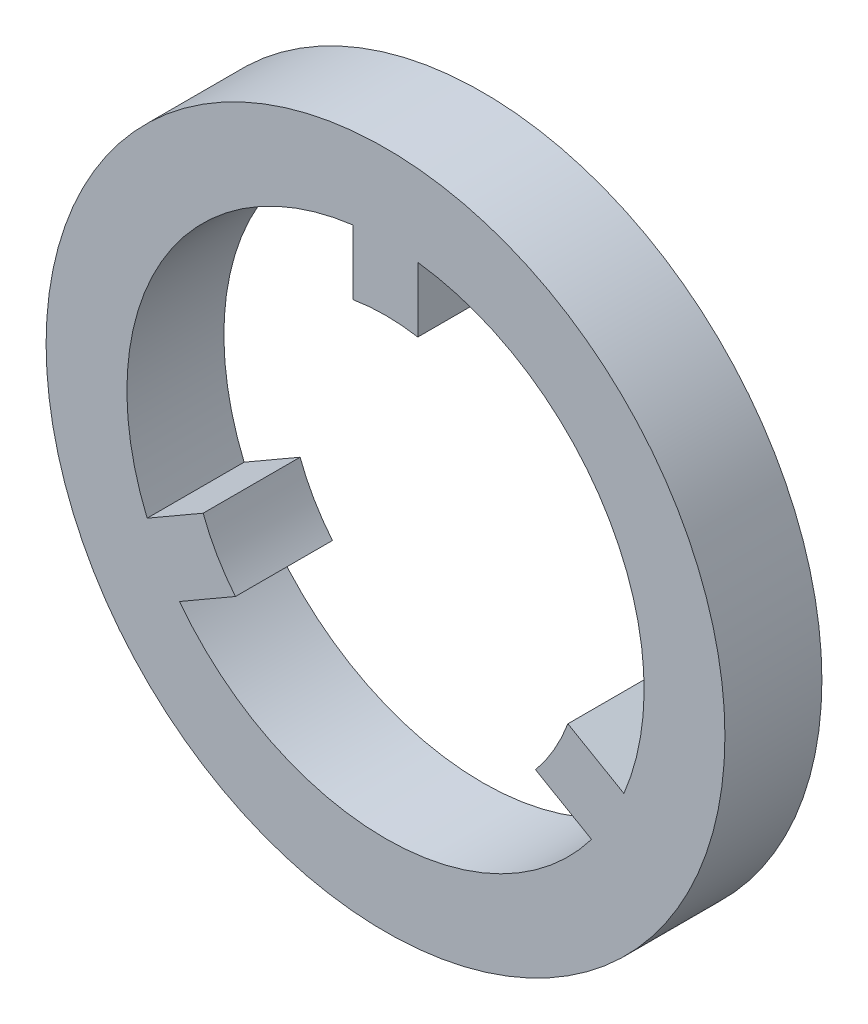
ISO-10303-21;
HEADER;
FILE_DESCRIPTION(('STEP AP214'),'2;1');
FILE_NAME('part.step','',(''),(''),'','','');
FILE_SCHEMA(('AUTOMOTIVE_DESIGN { 1 0 10303 214 1 1 1 1 }'));
ENDSEC;
DATA;
#1=APPLICATION_CONTEXT('core data for automotive mechanical design processes');
#2=APPLICATION_PROTOCOL_DEFINITION('international standard','automotive_design',2000,#1);
#3=PRODUCT_CONTEXT('',#1,'mechanical');
#4=PRODUCT('Part','Part','',(#3));
#5=PRODUCT_RELATED_PRODUCT_CATEGORY('part','',(#4));
#6=PRODUCT_DEFINITION_FORMATION('','',#4);
#7=PRODUCT_DEFINITION_CONTEXT('part definition',#1,'design');
#8=PRODUCT_DEFINITION('design','',#6,#7);
#9=PRODUCT_DEFINITION_SHAPE('','',#8);
#10=(LENGTH_UNIT() NAMED_UNIT(*) SI_UNIT(.MILLI.,.METRE.));
#11=(NAMED_UNIT(*) PLANE_ANGLE_UNIT() SI_UNIT($,.RADIAN.));
#12=(NAMED_UNIT(*) SI_UNIT($,.STERADIAN.) SOLID_ANGLE_UNIT());
#13=UNCERTAINTY_MEASURE_WITH_UNIT(LENGTH_MEASURE(1.E-05),#10,'distance_accuracy_value','');
#14=(GEOMETRIC_REPRESENTATION_CONTEXT(3) GLOBAL_UNCERTAINTY_ASSIGNED_CONTEXT((#13)) GLOBAL_UNIT_ASSIGNED_CONTEXT((#10,
#11,#12)) REPRESENTATION_CONTEXT('',''));
#15=CARTESIAN_POINT('',(0.,0.,0.));
#16=DIRECTION('',(0.,0.,1.));
#17=DIRECTION('',(1.,0.,0.));
#18=AXIS2_PLACEMENT_3D('',#15,#16,#17);
#19=CARTESIAN_POINT('',(0.,0.,3.));
#20=DIRECTION('',(0.,0.,-1.));
#21=DIRECTION('',(-1.,0.,0.));
#22=AXIS2_PLACEMENT_3D('',#19,#20,#21);
#23=CYLINDRICAL_SURFACE('',#22,8.00000000000001);
#24=CARTESIAN_POINT('',(0.,0.,0.));
#25=DIRECTION('',(0.,0.,1.));
#26=DIRECTION('',(1.,0.,0.));
#27=AXIS2_PLACEMENT_3D('',#24,#25,#26);
#28=CIRCLE('',#27,8.00000000000001);
#29=CARTESIAN_POINT('',(7.37386354243377,-3.10260156281245,0.));
#30=VERTEX_POINT('',#29);
#31=CARTESIAN_POINT('',(1.,7.93725393319378,0.));
#32=VERTEX_POINT('',#31);
#33=EDGE_CURVE('E160',#30,#32,#28,.T.);
#34=ORIENTED_EDGE('',*,*,#33,.F.);
#35=DIRECTION('',(0.,0.,-1.));
#36=VECTOR('',#35,1.);
#37=CARTESIAN_POINT('',(7.37386354243377,-3.10260156281245,3.));
#38=LINE('',#37,#36);
#39=CARTESIAN_POINT('',(7.37386354243377,-3.10260156281245,3.));
#40=VERTEX_POINT('',#39);
#41=EDGE_CURVE('E11',#40,#30,#38,.T.);
#42=ORIENTED_EDGE('',*,*,#41,.F.);
#43=CARTESIAN_POINT('',(0.,0.,3.));
#44=DIRECTION('',(0.,0.,1.));
#45=DIRECTION('',(1.,0.,0.));
#46=AXIS2_PLACEMENT_3D('',#43,#44,#45);
#47=CIRCLE('',#46,8.00000000000001);
#48=CARTESIAN_POINT('',(1.,7.93725393319378,3.));
#49=VERTEX_POINT('',#48);
#50=EDGE_CURVE('E191',#40,#49,#47,.T.);
#51=ORIENTED_EDGE('',*,*,#50,.T.);
#52=DIRECTION('',(0.,0.,-1.));
#53=VECTOR('',#52,1.);
#54=CARTESIAN_POINT('',(1.,7.93725393319378,3.));
#55=LINE('',#54,#53);
#56=EDGE_CURVE('E54',#49,#32,#55,.T.);
#57=ORIENTED_EDGE('',*,*,#56,.T.);
#58=EDGE_LOOP('',(#34,#42,#51,#57));
#59=FACE_BOUND('',#58,.T.);
#60=ADVANCED_FACE('F37',(#59),#23,.F.);
#61=CARTESIAN_POINT('',(0.5,0.866025403784439,3.));
#62=DIRECTION('',(-0.5,-0.866025403784439,0.));
#63=DIRECTION('',(0.866025403784439,-0.5,0.));
#64=AXIS2_PLACEMENT_3D('',#61,#62,#63);
#65=PLANE('',#64);
#66=DIRECTION('',(-0.866025403784439,0.5,0.));
#67=VECTOR('',#66,1.);
#68=CARTESIAN_POINT('',(0.5,0.866025403784439,0.));
#69=LINE('',#68,#67);
#70=CARTESIAN_POINT('',(5.64181273486489,-2.10260156281245,0.));
#71=VERTEX_POINT('',#70);
#72=EDGE_CURVE('E162',#30,#71,#69,.T.);
#73=ORIENTED_EDGE('',*,*,#72,.T.);
#74=DIRECTION('',(0.,0.,-1.));
#75=VECTOR('',#74,1.);
#76=CARTESIAN_POINT('',(5.64181273486489,-2.10260156281245,3.));
#77=LINE('',#76,#75);
#78=CARTESIAN_POINT('',(5.64181273486489,-2.10260156281245,3.));
#79=VERTEX_POINT('',#78);
#80=EDGE_CURVE('E46',#79,#71,#77,.T.);
#81=ORIENTED_EDGE('',*,*,#80,.F.);
#82=DIRECTION('',(-0.866025403784439,0.5,0.));
#83=VECTOR('',#82,1.);
#84=CARTESIAN_POINT('',(0.5,0.866025403784439,3.));
#85=LINE('',#84,#83);
#86=EDGE_CURVE('E229',#40,#79,#85,.T.);
#87=ORIENTED_EDGE('',*,*,#86,.F.);
#88=ORIENTED_EDGE('',*,*,#41,.T.);
#89=EDGE_LOOP('',(#73,#81,#87,#88));
#90=FACE_BOUND('',#89,.T.);
#91=ADVANCED_FACE('F39',(#90),#65,.F.);
#92=CARTESIAN_POINT('',(0.,0.,3.));
#93=DIRECTION('',(0.,0.,-1.));
#94=DIRECTION('',(-1.,0.,0.));
#95=AXIS2_PLACEMENT_3D('',#92,#93,#94);
#96=CYLINDRICAL_SURFACE('',#95,6.02087902778531);
#97=CARTESIAN_POINT('',(0.,0.,0.));
#98=DIRECTION('',(0.,0.,1.));
#99=DIRECTION('',(1.,0.,0.));
#100=AXIS2_PLACEMENT_3D('',#97,#98,#99);
#101=CIRCLE('',#100,6.02087902778531);
#102=CARTESIAN_POINT('',(4.64181273486489,-3.83465237038133,0.));
#103=VERTEX_POINT('',#102);
#104=EDGE_CURVE('E167',#103,#71,#101,.T.);
#105=ORIENTED_EDGE('',*,*,#104,.F.);
#106=DIRECTION('',(0.,0.,-1.));
#107=VECTOR('',#106,1.);
#108=CARTESIAN_POINT('',(4.64181273486489,-3.83465237038133,3.));
#109=LINE('',#108,#107);
#110=CARTESIAN_POINT('',(4.64181273486489,-3.83465237038133,3.));
#111=VERTEX_POINT('',#110);
#112=EDGE_CURVE('E205',#111,#103,#109,.T.);
#113=ORIENTED_EDGE('',*,*,#112,.F.);
#114=CARTESIAN_POINT('',(0.,0.,3.));
#115=DIRECTION('',(0.,0.,1.));
#116=DIRECTION('',(1.,0.,0.));
#117=AXIS2_PLACEMENT_3D('',#114,#115,#116);
#118=CIRCLE('',#117,6.02087902778531);
#119=EDGE_CURVE('E212',#111,#79,#118,.T.);
#120=ORIENTED_EDGE('',*,*,#119,.T.);
#121=ORIENTED_EDGE('',*,*,#80,.T.);
#122=EDGE_LOOP('',(#105,#113,#120,#121));
#123=FACE_BOUND('',#122,.T.);
#124=ADVANCED_FACE('F210',(#123),#96,.F.);
#125=CARTESIAN_POINT('',(-0.499999999999995,-0.866025403784425,3.));
#126=DIRECTION('',(-0.500000000000002,-0.866025403784438,0.));
#127=DIRECTION('',(0.866025403784438,-0.500000000000002,0.));
#128=AXIS2_PLACEMENT_3D('',#125,#126,#127);
#129=PLANE('',#128);
#130=DIRECTION('',(-0.866025403784438,0.500000000000002,0.));
#131=VECTOR('',#130,1.);
#132=CARTESIAN_POINT('',(-0.499999999999995,-0.866025403784425,0.));
#133=LINE('',#132,#131);
#134=CARTESIAN_POINT('',(6.37386354243376,-4.83465237038133,0.));
#135=VERTEX_POINT('',#134);
#136=EDGE_CURVE('E170',#135,#103,#133,.T.);
#137=ORIENTED_EDGE('',*,*,#136,.F.);
#138=DIRECTION('',(0.,0.,-1.));
#139=VECTOR('',#138,1.);
#140=CARTESIAN_POINT('',(6.37386354243376,-4.83465237038133,3.));
#141=LINE('',#140,#139);
#142=CARTESIAN_POINT('',(6.37386354243376,-4.83465237038133,3.));
#143=VERTEX_POINT('',#142);
#144=EDGE_CURVE('E203',#143,#135,#141,.T.);
#145=ORIENTED_EDGE('',*,*,#144,.F.);
#146=DIRECTION('',(-0.866025403784438,0.500000000000002,0.));
#147=VECTOR('',#146,1.);
#148=CARTESIAN_POINT('',(-0.499999999999995,-0.866025403784425,3.));
#149=LINE('',#148,#147);
#150=EDGE_CURVE('E226',#143,#111,#149,.T.);
#151=ORIENTED_EDGE('',*,*,#150,.T.);
#152=ORIENTED_EDGE('',*,*,#112,.T.);
#153=EDGE_LOOP('',(#137,#145,#151,#152));
#154=FACE_BOUND('',#153,.T.);
#155=ADVANCED_FACE('F223',(#154),#129,.T.);
#156=CARTESIAN_POINT('',(-6.37386354243376,-4.83465237038133,0.));
#157=VERTEX_POINT('',#156);
#158=EDGE_CURVE('E164',#157,#135,#28,.T.);
#159=ORIENTED_EDGE('',*,*,#158,.F.);
#160=DIRECTION('',(0.,0.,-1.));
#161=VECTOR('',#160,1.);
#162=CARTESIAN_POINT('',(-6.37386354243376,-4.83465237038133,3.));
#163=LINE('',#162,#161);
#164=CARTESIAN_POINT('',(-6.37386354243376,-4.83465237038133,3.));
#165=VERTEX_POINT('',#164);
#166=EDGE_CURVE('E201',#165,#157,#163,.T.);
#167=ORIENTED_EDGE('',*,*,#166,.F.);
#168=EDGE_CURVE('E231',#165,#143,#47,.T.);
#169=ORIENTED_EDGE('',*,*,#168,.T.);
#170=ORIENTED_EDGE('',*,*,#144,.T.);
#171=EDGE_LOOP('',(#159,#167,#169,#170));
#172=FACE_BOUND('',#171,.T.);
#173=ADVANCED_FACE('F257',(#172),#23,.F.);
#174=CARTESIAN_POINT('',(0.500000000000001,-0.86602540378444,3.));
#175=DIRECTION('',(-0.5,0.866025403784439,0.));
#176=DIRECTION('',(-0.866025403784439,-0.5,0.));
#177=AXIS2_PLACEMENT_3D('',#174,#175,#176);
#178=PLANE('',#177);
#179=DIRECTION('',(0.866025403784439,0.5,0.));
#180=VECTOR('',#179,1.);
#181=CARTESIAN_POINT('',(0.500000000000001,-0.86602540378444,0.));
#182=LINE('',#181,#180);
#183=CARTESIAN_POINT('',(-4.64181273486489,-3.83465237038133,0.));
#184=VERTEX_POINT('',#183);
#185=EDGE_CURVE('E173',#157,#184,#182,.T.);
#186=ORIENTED_EDGE('',*,*,#185,.T.);
#187=DIRECTION('',(0.,0.,-1.));
#188=VECTOR('',#187,1.);
#189=CARTESIAN_POINT('',(-4.64181273486489,-3.83465237038133,3.));
#190=LINE('',#189,#188);
#191=CARTESIAN_POINT('',(-4.64181273486489,-3.83465237038133,3.));
#192=VERTEX_POINT('',#191);
#193=EDGE_CURVE('E199',#192,#184,#190,.T.);
#194=ORIENTED_EDGE('',*,*,#193,.F.);
#195=DIRECTION('',(0.866025403784439,0.5,0.));
#196=VECTOR('',#195,1.);
#197=CARTESIAN_POINT('',(0.500000000000001,-0.86602540378444,3.));
#198=LINE('',#197,#196);
#199=EDGE_CURVE('E236',#165,#192,#198,.T.);
#200=ORIENTED_EDGE('',*,*,#199,.F.);
#201=ORIENTED_EDGE('',*,*,#166,.T.);
#202=EDGE_LOOP('',(#186,#194,#200,#201));
#203=FACE_BOUND('',#202,.T.);
#204=ADVANCED_FACE('F265',(#203),#178,.F.);
#205=CARTESIAN_POINT('',(0.,0.,3.));
#206=DIRECTION('',(0.,0.,-1.));
#207=DIRECTION('',(-1.,0.,0.));
#208=AXIS2_PLACEMENT_3D('',#205,#206,#207);
#209=CYLINDRICAL_SURFACE('',#208,6.02087902778531);
#210=CARTESIAN_POINT('',(0.,0.,0.));
#211=DIRECTION('',(0.,0.,1.));
#212=DIRECTION('',(1.,0.,0.));
#213=AXIS2_PLACEMENT_3D('',#210,#211,#212);
#214=CIRCLE('',#213,6.02087902778531);
#215=CARTESIAN_POINT('',(-5.64181273486489,-2.10260156281245,0.));
#216=VERTEX_POINT('',#215);
#217=EDGE_CURVE('E176',#216,#184,#214,.T.);
#218=ORIENTED_EDGE('',*,*,#217,.F.);
#219=DIRECTION('',(0.,0.,-1.));
#220=VECTOR('',#219,1.);
#221=CARTESIAN_POINT('',(-5.64181273486489,-2.10260156281245,3.));
#222=LINE('',#221,#220);
#223=CARTESIAN_POINT('',(-5.64181273486489,-2.10260156281245,3.));
#224=VERTEX_POINT('',#223);
#225=EDGE_CURVE('E197',#224,#216,#222,.T.);
#226=ORIENTED_EDGE('',*,*,#225,.F.);
#227=CARTESIAN_POINT('',(0.,0.,3.));
#228=DIRECTION('',(0.,0.,1.));
#229=DIRECTION('',(1.,0.,0.));
#230=AXIS2_PLACEMENT_3D('',#227,#228,#229);
#231=CIRCLE('',#230,6.02087902778531);
#232=EDGE_CURVE('E238',#224,#192,#231,.T.);
#233=ORIENTED_EDGE('',*,*,#232,.T.);
#234=ORIENTED_EDGE('',*,*,#193,.T.);
#235=EDGE_LOOP('',(#218,#226,#233,#234));
#236=FACE_BOUND('',#235,.T.);
#237=ADVANCED_FACE('F273',(#236),#209,.F.);
#238=CARTESIAN_POINT('',(-0.499999999999999,0.866025403784437,3.));
#239=DIRECTION('',(-0.5,0.866025403784439,0.));
#240=DIRECTION('',(-0.866025403784439,-0.5,0.));
#241=AXIS2_PLACEMENT_3D('',#238,#239,#240);
#242=PLANE('',#241);
#243=DIRECTION('',(0.866025403784439,0.5,0.));
#244=VECTOR('',#243,1.);
#245=CARTESIAN_POINT('',(-0.499999999999999,0.866025403784437,0.));
#246=LINE('',#245,#244);
#247=CARTESIAN_POINT('',(-7.37386354243376,-3.10260156281245,0.));
#248=VERTEX_POINT('',#247);
#249=EDGE_CURVE('E179',#248,#216,#246,.T.);
#250=ORIENTED_EDGE('',*,*,#249,.F.);
#251=DIRECTION('',(0.,0.,-1.));
#252=VECTOR('',#251,1.);
#253=CARTESIAN_POINT('',(-7.37386354243376,-3.10260156281245,3.));
#254=LINE('',#253,#252);
#255=CARTESIAN_POINT('',(-7.37386354243376,-3.10260156281245,3.));
#256=VERTEX_POINT('',#255);
#257=EDGE_CURVE('E195',#256,#248,#254,.T.);
#258=ORIENTED_EDGE('',*,*,#257,.F.);
#259=DIRECTION('',(0.866025403784439,0.5,0.));
#260=VECTOR('',#259,1.);
#261=CARTESIAN_POINT('',(-0.499999999999999,0.866025403784437,3.));
#262=LINE('',#261,#260);
#263=EDGE_CURVE('E240',#256,#224,#262,.T.);
#264=ORIENTED_EDGE('',*,*,#263,.T.);
#265=ORIENTED_EDGE('',*,*,#225,.T.);
#266=EDGE_LOOP('',(#250,#258,#264,#265));
#267=FACE_BOUND('',#266,.T.);
#268=ADVANCED_FACE('F268',(#267),#242,.T.);
#269=CARTESIAN_POINT('',(-1.,7.93725393319378,0.));
#270=VERTEX_POINT('',#269);
#271=EDGE_CURVE('E163',#270,#248,#28,.T.);
#272=ORIENTED_EDGE('',*,*,#271,.F.);
#273=DIRECTION('',(0.,0.,-1.));
#274=VECTOR('',#273,1.);
#275=CARTESIAN_POINT('',(-1.,7.93725393319378,3.));
#276=LINE('',#275,#274);
#277=CARTESIAN_POINT('',(-1.,7.93725393319378,3.));
#278=VERTEX_POINT('',#277);
#279=EDGE_CURVE('E149',#278,#270,#276,.T.);
#280=ORIENTED_EDGE('',*,*,#279,.F.);
#281=EDGE_CURVE('E139',#278,#256,#47,.T.);
#282=ORIENTED_EDGE('',*,*,#281,.T.);
#283=ORIENTED_EDGE('',*,*,#257,.T.);
#284=EDGE_LOOP('',(#272,#280,#282,#283));
#285=FACE_BOUND('',#284,.T.);
#286=ADVANCED_FACE('F258',(#285),#23,.F.);
#287=CARTESIAN_POINT('',(-0.999999999999998,0.,3.));
#288=DIRECTION('',(1.,0.,0.));
#289=DIRECTION('',(0.,1.,0.));
#290=AXIS2_PLACEMENT_3D('',#287,#288,#289);
#291=PLANE('',#290);
#292=DIRECTION('',(0.,-1.,0.));
#293=VECTOR('',#292,1.);
#294=CARTESIAN_POINT('',(-0.999999999999998,0.,0.));
#295=LINE('',#294,#293);
#296=CARTESIAN_POINT('',(-1.,5.93725393319378,0.));
#297=VERTEX_POINT('',#296);
#298=EDGE_CURVE('E146',#270,#297,#295,.T.);
#299=ORIENTED_EDGE('',*,*,#298,.T.);
#300=DIRECTION('',(0.,0.,-1.));
#301=VECTOR('',#300,1.);
#302=CARTESIAN_POINT('',(-1.,5.93725393319378,3.));
#303=LINE('',#302,#301);
#304=CARTESIAN_POINT('',(-1.,5.93725393319378,3.));
#305=VERTEX_POINT('',#304);
#306=EDGE_CURVE('E143',#305,#297,#303,.T.);
#307=ORIENTED_EDGE('',*,*,#306,.F.);
#308=DIRECTION('',(0.,-1.,0.));
#309=VECTOR('',#308,1.);
#310=CARTESIAN_POINT('',(-0.999999999999998,0.,3.));
#311=LINE('',#310,#309);
#312=EDGE_CURVE('E129',#278,#305,#311,.T.);
#313=ORIENTED_EDGE('',*,*,#312,.F.);
#314=ORIENTED_EDGE('',*,*,#279,.T.);
#315=EDGE_LOOP('',(#299,#307,#313,#314));
#316=FACE_BOUND('',#315,.T.);
#317=ADVANCED_FACE('F144',(#316),#291,.F.);
#318=CARTESIAN_POINT('',(0.,0.,3.));
#319=DIRECTION('',(0.,0.,-1.));
#320=DIRECTION('',(-1.,0.,0.));
#321=AXIS2_PLACEMENT_3D('',#318,#319,#320);
#322=CYLINDRICAL_SURFACE('',#321,6.02087902778531);
#323=CARTESIAN_POINT('',(0.,0.,0.));
#324=DIRECTION('',(0.,0.,1.));
#325=DIRECTION('',(1.,0.,0.));
#326=AXIS2_PLACEMENT_3D('',#323,#324,#325);
#327=CIRCLE('',#326,6.02087902778531);
#328=CARTESIAN_POINT('',(1.,5.93725393319378,0.));
#329=VERTEX_POINT('',#328);
#330=EDGE_CURVE('E183',#329,#297,#327,.T.);
#331=ORIENTED_EDGE('',*,*,#330,.F.);
#332=DIRECTION('',(0.,0.,-1.));
#333=VECTOR('',#332,1.);
#334=CARTESIAN_POINT('',(1.,5.93725393319378,3.));
#335=LINE('',#334,#333);
#336=CARTESIAN_POINT('',(1.,5.93725393319378,3.));
#337=VERTEX_POINT('',#336);
#338=EDGE_CURVE('E91',#337,#329,#335,.T.);
#339=ORIENTED_EDGE('',*,*,#338,.F.);
#340=CARTESIAN_POINT('',(0.,0.,3.));
#341=DIRECTION('',(0.,0.,1.));
#342=DIRECTION('',(1.,0.,0.));
#343=AXIS2_PLACEMENT_3D('',#340,#341,#342);
#344=CIRCLE('',#343,6.02087902778531);
#345=EDGE_CURVE('E136',#337,#305,#344,.T.);
#346=ORIENTED_EDGE('',*,*,#345,.T.);
#347=ORIENTED_EDGE('',*,*,#306,.T.);
#348=EDGE_LOOP('',(#331,#339,#346,#347));
#349=FACE_BOUND('',#348,.T.);
#350=ADVANCED_FACE('F151',(#349),#322,.F.);
#351=CARTESIAN_POINT('',(1.,0.,3.));
#352=DIRECTION('',(1.,0.,0.));
#353=DIRECTION('',(0.,1.,0.));
#354=AXIS2_PLACEMENT_3D('',#351,#352,#353);
#355=PLANE('',#354);
#356=DIRECTION('',(0.,-1.,0.));
#357=VECTOR('',#356,1.);
#358=CARTESIAN_POINT('',(1.,0.,0.));
#359=LINE('',#358,#357);
#360=EDGE_CURVE('E185',#32,#329,#359,.T.);
#361=ORIENTED_EDGE('',*,*,#360,.F.);
#362=ORIENTED_EDGE('',*,*,#56,.F.);
#363=DIRECTION('',(0.,-1.,0.));
#364=VECTOR('',#363,1.);
#365=CARTESIAN_POINT('',(1.,0.,3.));
#366=LINE('',#365,#364);
#367=EDGE_CURVE('E152',#49,#337,#366,.T.);
#368=ORIENTED_EDGE('',*,*,#367,.T.);
#369=ORIENTED_EDGE('',*,*,#338,.T.);
#370=EDGE_LOOP('',(#361,#362,#368,#369));
#371=FACE_BOUND('',#370,.T.);
#372=ADVANCED_FACE('F244',(#371),#355,.T.);
#373=CARTESIAN_POINT('',(0.,0.,3.));
#374=DIRECTION('',(0.,0.,-1.));
#375=DIRECTION('',(-1.,0.,0.));
#376=AXIS2_PLACEMENT_3D('',#373,#374,#375);
#377=CYLINDRICAL_SURFACE('',#376,10.5);
#378=CARTESIAN_POINT('',(0.,0.,3.));
#379=DIRECTION('',(0.,0.,1.));
#380=DIRECTION('',(1.,0.,0.));
#381=AXIS2_PLACEMENT_3D('',#378,#379,#380);
#382=CIRCLE('',#381,10.5);
#383=CARTESIAN_POINT('',(10.5,0.,3.));
#384=VERTEX_POINT('',#383);
#385=EDGE_CURVE('E154',#384,#384,#382,.T.);
#386=ORIENTED_EDGE('',*,*,#385,.F.);
#387=EDGE_LOOP('',(#386));
#388=FACE_BOUND('',#387,.T.);
#389=CARTESIAN_POINT('',(0.,0.,0.));
#390=DIRECTION('',(0.,0.,1.));
#391=DIRECTION('',(1.,0.,0.));
#392=AXIS2_PLACEMENT_3D('',#389,#390,#391);
#393=CIRCLE('',#392,10.5);
#394=CARTESIAN_POINT('',(10.5,0.,0.));
#395=VERTEX_POINT('',#394);
#396=EDGE_CURVE('E188',#395,#395,#393,.T.);
#397=ORIENTED_EDGE('',*,*,#396,.T.);
#398=EDGE_LOOP('',(#397));
#399=FACE_BOUND('',#398,.T.);
#400=ADVANCED_FACE('F246',(#388,#399),#377,.T.);
#401=CARTESIAN_POINT('',(0.,0.,3.));
#402=DIRECTION('',(0.,0.,1.));
#403=DIRECTION('',(1.,0.,0.));
#404=AXIS2_PLACEMENT_3D('',#401,#402,#403);
#405=PLANE('',#404);
#406=ORIENTED_EDGE('',*,*,#50,.F.);
#407=ORIENTED_EDGE('',*,*,#86,.T.);
#408=ORIENTED_EDGE('',*,*,#119,.F.);
#409=ORIENTED_EDGE('',*,*,#150,.F.);
#410=ORIENTED_EDGE('',*,*,#168,.F.);
#411=ORIENTED_EDGE('',*,*,#199,.T.);
#412=ORIENTED_EDGE('',*,*,#232,.F.);
#413=ORIENTED_EDGE('',*,*,#263,.F.);
#414=ORIENTED_EDGE('',*,*,#281,.F.);
#415=ORIENTED_EDGE('',*,*,#312,.T.);
#416=ORIENTED_EDGE('',*,*,#345,.F.);
#417=ORIENTED_EDGE('',*,*,#367,.F.);
#418=EDGE_LOOP('',(#406,#407,#408,#409,#410,#411,#412,#413,#414,#415,#416,#417));
#419=FACE_BOUND('',#418,.T.);
#420=ORIENTED_EDGE('',*,*,#385,.T.);
#421=EDGE_LOOP('',(#420));
#422=FACE_BOUND('',#421,.T.);
#423=ADVANCED_FACE('F132',(#419,#422),#405,.T.);
#424=CARTESIAN_POINT('',(0.,0.,0.));
#425=DIRECTION('',(0.,0.,1.));
#426=DIRECTION('',(1.,0.,0.));
#427=AXIS2_PLACEMENT_3D('',#424,#425,#426);
#428=PLANE('',#427);
#429=ORIENTED_EDGE('',*,*,#33,.T.);
#430=ORIENTED_EDGE('',*,*,#360,.T.);
#431=ORIENTED_EDGE('',*,*,#330,.T.);
#432=ORIENTED_EDGE('',*,*,#298,.F.);
#433=ORIENTED_EDGE('',*,*,#271,.T.);
#434=ORIENTED_EDGE('',*,*,#249,.T.);
#435=ORIENTED_EDGE('',*,*,#217,.T.);
#436=ORIENTED_EDGE('',*,*,#185,.F.);
#437=ORIENTED_EDGE('',*,*,#158,.T.);
#438=ORIENTED_EDGE('',*,*,#136,.T.);
#439=ORIENTED_EDGE('',*,*,#104,.T.);
#440=ORIENTED_EDGE('',*,*,#72,.F.);
#441=EDGE_LOOP('',(#429,#430,#431,#432,#433,#434,#435,#436,#437,#438,#439,#440));
#442=FACE_BOUND('',#441,.T.);
#443=ORIENTED_EDGE('',*,*,#396,.F.);
#444=EDGE_LOOP('',(#443));
#445=FACE_BOUND('',#444,.T.);
#446=ADVANCED_FACE('F216',(#442,#445),#428,.F.);
#447=CLOSED_SHELL('',(#60,#91,#124,#155,#173,#204,#237,#268,#286,#317,#350,#372,#400,#423,#446));
#448=MANIFOLD_SOLID_BREP('B2',#447);
#449=ADVANCED_BREP_SHAPE_REPRESENTATION('',(#18,#448),#14);
#450=SHAPE_DEFINITION_REPRESENTATION(#9,#449);
ENDSEC;
END-ISO-10303-21;
